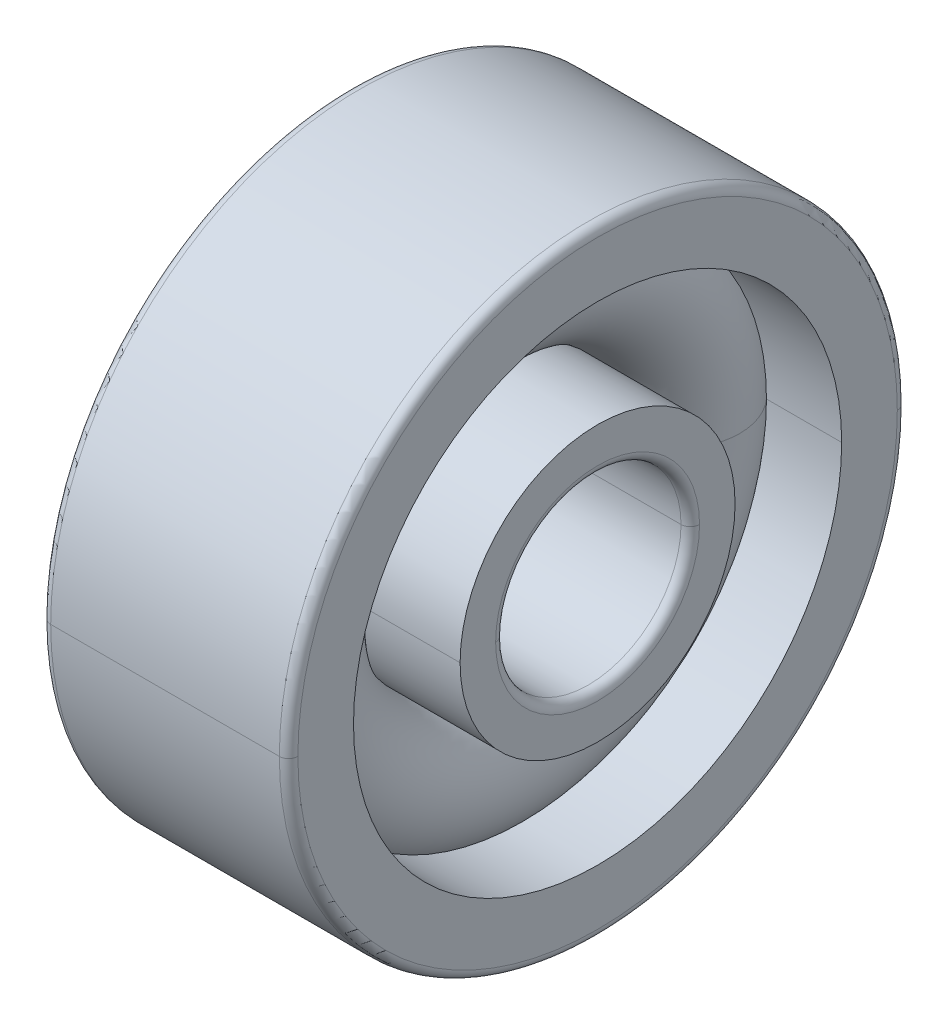
ISO-10303-21;
HEADER;
FILE_DESCRIPTION(('STEP AP214'),'2;1');
FILE_NAME('part.step','',(''),(''),'','','');
FILE_SCHEMA(('AUTOMOTIVE_DESIGN { 1 0 10303 214 1 1 1 1 }'));
ENDSEC;
DATA;
#1=APPLICATION_CONTEXT('core data for automotive mechanical design processes');
#2=APPLICATION_PROTOCOL_DEFINITION('international standard','automotive_design',2000,#1);
#3=PRODUCT_CONTEXT('',#1,'mechanical');
#4=PRODUCT('Part','Part','',(#3));
#5=PRODUCT_RELATED_PRODUCT_CATEGORY('part','',(#4));
#6=PRODUCT_DEFINITION_FORMATION('','',#4);
#7=PRODUCT_DEFINITION_CONTEXT('part definition',#1,'design');
#8=PRODUCT_DEFINITION('design','',#6,#7);
#9=PRODUCT_DEFINITION_SHAPE('','',#8);
#10=(LENGTH_UNIT() NAMED_UNIT(*) SI_UNIT(.MILLI.,.METRE.));
#11=(NAMED_UNIT(*) PLANE_ANGLE_UNIT() SI_UNIT($,.RADIAN.));
#12=(NAMED_UNIT(*) SI_UNIT($,.STERADIAN.) SOLID_ANGLE_UNIT());
#13=UNCERTAINTY_MEASURE_WITH_UNIT(LENGTH_MEASURE(1.E-05),#10,'distance_accuracy_value','');
#14=(GEOMETRIC_REPRESENTATION_CONTEXT(3) GLOBAL_UNCERTAINTY_ASSIGNED_CONTEXT((#13)) GLOBAL_UNIT_ASSIGNED_CONTEXT((#10,
#11,#12)) REPRESENTATION_CONTEXT('',''));
#15=CARTESIAN_POINT('',(0.,0.,0.));
#16=DIRECTION('',(0.,0.,1.));
#17=DIRECTION('',(1.,0.,0.));
#18=AXIS2_PLACEMENT_3D('',#15,#16,#17);
#19=CARTESIAN_POINT('',(-2.,4.275,0.));
#20=DIRECTION('',(-1.,0.,0.));
#21=DIRECTION('',(0.,0.,1.));
#22=AXIS2_PLACEMENT_3D('',#19,#20,#21);
#23=PLANE('',#22);
#24=CARTESIAN_POINT('',(-2.,0.,0.));
#25=DIRECTION('',(1.,0.,0.));
#26=DIRECTION('',(0.,0.,-1.));
#27=AXIS2_PLACEMENT_3D('',#24,#25,#26);
#28=CIRCLE('',#27,4.275);
#29=CARTESIAN_POINT('',(-2.,0.,-4.275));
#30=VERTEX_POINT('',#29);
#31=CARTESIAN_POINT('',(-2.,0.,4.275));
#32=VERTEX_POINT('',#31);
#33=EDGE_CURVE('E220',#30,#32,#28,.T.);
#34=ORIENTED_EDGE('',*,*,#33,.T.);
#35=CARTESIAN_POINT('',(-2.,0.,0.));
#36=DIRECTION('',(1.,0.,0.));
#37=DIRECTION('',(0.,0.,-1.));
#38=AXIS2_PLACEMENT_3D('',#35,#36,#37);
#39=CIRCLE('',#38,4.275);
#40=EDGE_CURVE('E250',#32,#30,#39,.T.);
#41=ORIENTED_EDGE('',*,*,#40,.T.);
#42=EDGE_LOOP('',(#34,#41));
#43=FACE_BOUND('',#42,.T.);
#44=CARTESIAN_POINT('',(-2.,0.,0.));
#45=DIRECTION('',(1.,0.,0.));
#46=DIRECTION('',(0.,0.,-1.));
#47=AXIS2_PLACEMENT_3D('',#44,#45,#46);
#48=CIRCLE('',#47,4.85);
#49=CARTESIAN_POINT('',(-2.,0.,-4.85));
#50=VERTEX_POINT('',#49);
#51=CARTESIAN_POINT('',(-2.,0.,4.85));
#52=VERTEX_POINT('',#51);
#53=EDGE_CURVE('E246',#50,#52,#48,.T.);
#54=ORIENTED_EDGE('',*,*,#53,.F.);
#55=CARTESIAN_POINT('',(-2.,0.,0.));
#56=DIRECTION('',(1.,0.,0.));
#57=DIRECTION('',(0.,0.,-1.));
#58=AXIS2_PLACEMENT_3D('',#55,#56,#57);
#59=CIRCLE('',#58,4.85);
#60=EDGE_CURVE('E19',#52,#50,#59,.T.);
#61=ORIENTED_EDGE('',*,*,#60,.F.);
#62=EDGE_LOOP('',(#54,#61));
#63=FACE_BOUND('',#62,.T.);
#64=ADVANCED_FACE('F16',(#43,#63),#23,.T.);
#65=CARTESIAN_POINT('',(2.,4.85,0.));
#66=DIRECTION('',(1.,0.,0.));
#67=DIRECTION('',(0.,1.,0.));
#68=AXIS2_PLACEMENT_3D('',#65,#66,#67);
#69=PLANE('',#68);
#70=CARTESIAN_POINT('',(2.,0.,0.));
#71=DIRECTION('',(1.,0.,0.));
#72=DIRECTION('',(0.,0.,-1.));
#73=AXIS2_PLACEMENT_3D('',#70,#71,#72);
#74=CIRCLE('',#73,3.95);
#75=CARTESIAN_POINT('',(2.,0.,-3.95));
#76=VERTEX_POINT('',#75);
#77=CARTESIAN_POINT('',(2.,0.,3.95));
#78=VERTEX_POINT('',#77);
#79=EDGE_CURVE('E215',#76,#78,#74,.T.);
#80=ORIENTED_EDGE('',*,*,#79,.F.);
#81=CARTESIAN_POINT('',(2.,0.,0.));
#82=DIRECTION('',(1.,0.,0.));
#83=DIRECTION('',(0.,0.,-1.));
#84=AXIS2_PLACEMENT_3D('',#81,#82,#83);
#85=CIRCLE('',#84,3.95);
#86=EDGE_CURVE('E288',#78,#76,#85,.T.);
#87=ORIENTED_EDGE('',*,*,#86,.F.);
#88=EDGE_LOOP('',(#80,#87));
#89=FACE_BOUND('',#88,.T.);
#90=CARTESIAN_POINT('',(2.,0.,0.));
#91=DIRECTION('',(1.,0.,0.));
#92=DIRECTION('',(0.,0.,-1.));
#93=AXIS2_PLACEMENT_3D('',#90,#91,#92);
#94=CIRCLE('',#93,4.85);
#95=CARTESIAN_POINT('',(2.,0.,-4.85));
#96=VERTEX_POINT('',#95);
#97=CARTESIAN_POINT('',(2.,0.,4.85));
#98=VERTEX_POINT('',#97);
#99=EDGE_CURVE('E423',#96,#98,#94,.T.);
#100=ORIENTED_EDGE('',*,*,#99,.T.);
#101=CARTESIAN_POINT('',(2.,0.,0.));
#102=DIRECTION('',(1.,0.,0.));
#103=DIRECTION('',(0.,0.,-1.));
#104=AXIS2_PLACEMENT_3D('',#101,#102,#103);
#105=CIRCLE('',#104,4.85);
#106=EDGE_CURVE('E11',#98,#96,#105,.T.);
#107=ORIENTED_EDGE('',*,*,#106,.T.);
#108=EDGE_LOOP('',(#100,#107));
#109=FACE_BOUND('',#108,.T.);
#110=ADVANCED_FACE('F439',(#89,#109),#69,.T.);
#111=CARTESIAN_POINT('',(1.85,0.,0.));
#112=DIRECTION('',(1.,0.,0.));
#113=DIRECTION('',(0.,0.,-1.));
#114=AXIS2_PLACEMENT_3D('',#111,#112,#113);
#115=TOROIDAL_SURFACE('',#114,4.85,0.149999999999999);
#116=CARTESIAN_POINT('',(1.85,0.,4.85));
#117=DIRECTION('',(0.,1.,0.));
#118=DIRECTION('',(0.,0.,1.));
#119=AXIS2_PLACEMENT_3D('',#116,#117,#118);
#120=CIRCLE('',#119,0.15);
#121=CARTESIAN_POINT('',(1.85,0.,5.));
#122=VERTEX_POINT('',#121);
#123=EDGE_CURVE('E416',#122,#98,#120,.T.);
#124=ORIENTED_EDGE('',*,*,#123,.F.);
#125=CARTESIAN_POINT('',(1.85,0.,0.));
#126=DIRECTION('',(1.,0.,0.));
#127=DIRECTION('',(0.,0.,-1.));
#128=AXIS2_PLACEMENT_3D('',#125,#126,#127);
#129=CIRCLE('',#128,5.);
#130=CARTESIAN_POINT('',(1.85,0.,-5.));
#131=VERTEX_POINT('',#130);
#132=EDGE_CURVE('E25',#122,#131,#129,.T.);
#133=ORIENTED_EDGE('',*,*,#132,.T.);
#134=CARTESIAN_POINT('',(1.85,0.,-4.85));
#135=DIRECTION('',(0.,-1.,0.));
#136=DIRECTION('',(0.,0.,-1.));
#137=AXIS2_PLACEMENT_3D('',#134,#135,#136);
#138=CIRCLE('',#137,0.15);
#139=EDGE_CURVE('E397',#131,#96,#138,.T.);
#140=ORIENTED_EDGE('',*,*,#139,.T.);
#141=ORIENTED_EDGE('',*,*,#106,.F.);
#142=EDGE_LOOP('',(#124,#133,#140,#141));
#143=FACE_BOUND('',#142,.T.);
#144=ADVANCED_FACE('F417',(#143),#115,.T.);
#145=CARTESIAN_POINT('',(-20.6375,0.,0.));
#146=DIRECTION('',(1.,0.,0.));
#147=DIRECTION('',(0.,0.,-1.));
#148=AXIS2_PLACEMENT_3D('',#145,#146,#147);
#149=CYLINDRICAL_SURFACE('',#148,5.);
#150=DIRECTION('',(1.,0.,0.));
#151=VECTOR('',#150,1.);
#152=CARTESIAN_POINT('',(-20.6375,0.,5.));
#153=LINE('',#152,#151);
#154=CARTESIAN_POINT('',(-1.85,0.,5.));
#155=VERTEX_POINT('',#154);
#156=EDGE_CURVE('E263',#155,#122,#153,.T.);
#157=ORIENTED_EDGE('',*,*,#156,.F.);
#158=CARTESIAN_POINT('',(-1.85,0.,0.));
#159=DIRECTION('',(1.,0.,0.));
#160=DIRECTION('',(0.,0.,-1.));
#161=AXIS2_PLACEMENT_3D('',#158,#159,#160);
#162=CIRCLE('',#161,5.);
#163=CARTESIAN_POINT('',(-1.85,0.,-5.));
#164=VERTEX_POINT('',#163);
#165=EDGE_CURVE('E216',#155,#164,#162,.T.);
#166=ORIENTED_EDGE('',*,*,#165,.T.);
#167=DIRECTION('',(1.,0.,0.));
#168=VECTOR('',#167,1.);
#169=CARTESIAN_POINT('',(-20.6375,0.,-5.));
#170=LINE('',#169,#168);
#171=EDGE_CURVE('E253',#164,#131,#170,.T.);
#172=ORIENTED_EDGE('',*,*,#171,.T.);
#173=ORIENTED_EDGE('',*,*,#132,.F.);
#174=EDGE_LOOP('',(#157,#166,#172,#173));
#175=FACE_BOUND('',#174,.T.);
#176=ADVANCED_FACE('F448',(#175),#149,.T.);
#177=CARTESIAN_POINT('',(-1.85,0.,0.));
#178=DIRECTION('',(1.,0.,0.));
#179=DIRECTION('',(0.,0.,-1.));
#180=AXIS2_PLACEMENT_3D('',#177,#178,#179);
#181=TOROIDAL_SURFACE('',#180,4.85,0.149999999999999);
#182=CARTESIAN_POINT('',(-1.85,0.,4.85));
#183=DIRECTION('',(0.,1.,0.));
#184=DIRECTION('',(0.,0.,1.));
#185=AXIS2_PLACEMENT_3D('',#182,#183,#184);
#186=CIRCLE('',#185,0.15);
#187=EDGE_CURVE('E239',#52,#155,#186,.T.);
#188=ORIENTED_EDGE('',*,*,#187,.F.);
#189=ORIENTED_EDGE('',*,*,#60,.T.);
#190=CARTESIAN_POINT('',(-1.85,0.,-4.85));
#191=DIRECTION('',(0.,-1.,0.));
#192=DIRECTION('',(0.,0.,-1.));
#193=AXIS2_PLACEMENT_3D('',#190,#191,#192);
#194=CIRCLE('',#193,0.15);
#195=EDGE_CURVE('E236',#50,#164,#194,.T.);
#196=ORIENTED_EDGE('',*,*,#195,.T.);
#197=ORIENTED_EDGE('',*,*,#165,.F.);
#198=EDGE_LOOP('',(#188,#189,#196,#197));
#199=FACE_BOUND('',#198,.T.);
#200=ADVANCED_FACE('F235',(#199),#181,.T.);
#201=CARTESIAN_POINT('',(-20.6375,0.,0.));
#202=DIRECTION('',(1.,0.,0.));
#203=DIRECTION('',(0.,0.,-1.));
#204=AXIS2_PLACEMENT_3D('',#201,#202,#203);
#205=CYLINDRICAL_SURFACE('',#204,4.275);
#206=DIRECTION('',(1.,0.,0.));
#207=VECTOR('',#206,1.);
#208=CARTESIAN_POINT('',(-20.6375,0.,4.275));
#209=LINE('',#208,#207);
#210=CARTESIAN_POINT('',(-0.227760839478607,0.,4.275));
#211=VERTEX_POINT('',#210);
#212=EDGE_CURVE('E267',#32,#211,#209,.T.);
#213=ORIENTED_EDGE('',*,*,#212,.F.);
#214=ORIENTED_EDGE('',*,*,#33,.F.);
#215=DIRECTION('',(1.,0.,0.));
#216=VECTOR('',#215,1.);
#217=CARTESIAN_POINT('',(-20.6375,0.,-4.275));
#218=LINE('',#217,#216);
#219=CARTESIAN_POINT('',(-0.227760839478607,0.,-4.275));
#220=VERTEX_POINT('',#219);
#221=EDGE_CURVE('E279',#30,#220,#218,.T.);
#222=ORIENTED_EDGE('',*,*,#221,.T.);
#223=CARTESIAN_POINT('',(-0.227760839478607,0.,0.));
#224=DIRECTION('',(-1.,0.,0.));
#225=DIRECTION('',(0.,0.,-1.));
#226=AXIS2_PLACEMENT_3D('',#223,#224,#225);
#227=CIRCLE('',#226,4.275);
#228=EDGE_CURVE('E293',#211,#220,#227,.T.);
#229=ORIENTED_EDGE('',*,*,#228,.F.);
#230=EDGE_LOOP('',(#213,#214,#222,#229));
#231=FACE_BOUND('',#230,.T.);
#232=ADVANCED_FACE('F382',(#231),#205,.F.);
#233=CARTESIAN_POINT('',(-20.6375,0.,0.));
#234=DIRECTION('',(1.,0.,0.));
#235=DIRECTION('',(0.,0.,-1.));
#236=AXIS2_PLACEMENT_3D('',#233,#234,#235);
#237=CYLINDRICAL_SURFACE('',#236,3.95);
#238=DIRECTION('',(1.,0.,0.));
#239=VECTOR('',#238,1.);
#240=CARTESIAN_POINT('',(-20.6375,0.,3.95));
#241=LINE('',#240,#239);
#242=CARTESIAN_POINT('',(0.782623792124926,0.,3.95));
#243=VERTEX_POINT('',#242);
#244=EDGE_CURVE('E284',#243,#78,#241,.T.);
#245=ORIENTED_EDGE('',*,*,#244,.F.);
#246=CARTESIAN_POINT('',(0.782623792124926,0.,0.));
#247=DIRECTION('',(1.,0.,0.));
#248=DIRECTION('',(0.,0.,1.));
#249=AXIS2_PLACEMENT_3D('',#246,#247,#248);
#250=CIRCLE('',#249,3.95);
#251=CARTESIAN_POINT('',(0.782623792124926,0.,-3.95));
#252=VERTEX_POINT('',#251);
#253=EDGE_CURVE('E179',#252,#243,#250,.T.);
#254=ORIENTED_EDGE('',*,*,#253,.F.);
#255=DIRECTION('',(1.,0.,0.));
#256=VECTOR('',#255,1.);
#257=CARTESIAN_POINT('',(-20.6375,0.,-3.95));
#258=LINE('',#257,#256);
#259=EDGE_CURVE('E289',#252,#76,#258,.T.);
#260=ORIENTED_EDGE('',*,*,#259,.T.);
#261=ORIENTED_EDGE('',*,*,#79,.T.);
#262=EDGE_LOOP('',(#245,#254,#260,#261));
#263=FACE_BOUND('',#262,.T.);
#264=ADVANCED_FACE('F457',(#263),#237,.F.);
#265=CARTESIAN_POINT('',(0.,0.,0.));
#266=DIRECTION('',(-1.,0.,0.));
#267=DIRECTION('',(0.,0.,1.));
#268=AXIS2_PLACEMENT_3D('',#265,#266,#267);
#269=TOROIDAL_SURFACE('',#268,3.25,1.05);
#270=CARTESIAN_POINT('',(0.,0.,-3.25));
#271=DIRECTION('',(0.,1.,0.));
#272=DIRECTION('',(0.,0.,1.));
#273=AXIS2_PLACEMENT_3D('',#270,#271,#272);
#274=CIRCLE('',#273,1.05);
#275=CARTESIAN_POINT('',(-0.782623792124927,0.,-2.55));
#276=VERTEX_POINT('',#275);
#277=EDGE_CURVE('E297',#220,#276,#274,.T.);
#278=ORIENTED_EDGE('',*,*,#277,.F.);
#279=CARTESIAN_POINT('',(-0.227760839478607,0.,0.));
#280=DIRECTION('',(-1.,0.,0.));
#281=DIRECTION('',(0.,0.,-1.));
#282=AXIS2_PLACEMENT_3D('',#279,#280,#281);
#283=CIRCLE('',#282,4.275);
#284=EDGE_CURVE('E270',#220,#211,#283,.T.);
#285=ORIENTED_EDGE('',*,*,#284,.T.);
#286=CARTESIAN_POINT('',(0.,0.,3.25));
#287=DIRECTION('',(0.,-1.,0.));
#288=DIRECTION('',(0.,0.,-1.));
#289=AXIS2_PLACEMENT_3D('',#286,#287,#288);
#290=CIRCLE('',#289,1.05);
#291=CARTESIAN_POINT('',(-0.782623792124927,0.,2.55));
#292=VERTEX_POINT('',#291);
#293=EDGE_CURVE('E305',#211,#292,#290,.T.);
#294=ORIENTED_EDGE('',*,*,#293,.T.);
#295=CARTESIAN_POINT('',(-0.782623792124927,0.,0.));
#296=DIRECTION('',(1.,0.,0.));
#297=DIRECTION('',(0.,0.,-1.));
#298=AXIS2_PLACEMENT_3D('',#295,#296,#297);
#299=CIRCLE('',#298,2.55);
#300=EDGE_CURVE('E212',#292,#276,#299,.T.);
#301=ORIENTED_EDGE('',*,*,#300,.T.);
#302=EDGE_LOOP('',(#278,#285,#294,#301));
#303=FACE_BOUND('',#302,.T.);
#304=ADVANCED_FACE('F375',(#303),#269,.T.);
#305=CARTESIAN_POINT('',(-2.,2.55,0.));
#306=DIRECTION('',(-1.,0.,0.));
#307=DIRECTION('',(0.,0.,1.));
#308=AXIS2_PLACEMENT_3D('',#305,#306,#307);
#309=PLANE('',#308);
#310=CARTESIAN_POINT('',(-2.,0.,0.));
#311=DIRECTION('',(1.,0.,0.));
#312=DIRECTION('',(0.,0.,-1.));
#313=AXIS2_PLACEMENT_3D('',#310,#311,#312);
#314=CIRCLE('',#313,1.65);
#315=CARTESIAN_POINT('',(-2.,0.,-1.65));
#316=VERTEX_POINT('',#315);
#317=CARTESIAN_POINT('',(-2.,0.,1.65));
#318=VERTEX_POINT('',#317);
#319=EDGE_CURVE('E325',#316,#318,#314,.T.);
#320=ORIENTED_EDGE('',*,*,#319,.T.);
#321=CARTESIAN_POINT('',(-2.,0.,0.));
#322=DIRECTION('',(1.,0.,0.));
#323=DIRECTION('',(0.,0.,-1.));
#324=AXIS2_PLACEMENT_3D('',#321,#322,#323);
#325=CIRCLE('',#324,1.65);
#326=EDGE_CURVE('E211',#318,#316,#325,.T.);
#327=ORIENTED_EDGE('',*,*,#326,.T.);
#328=EDGE_LOOP('',(#320,#327));
#329=FACE_BOUND('',#328,.T.);
#330=CARTESIAN_POINT('',(-2.,0.,0.));
#331=DIRECTION('',(1.,0.,0.));
#332=DIRECTION('',(0.,0.,-1.));
#333=AXIS2_PLACEMENT_3D('',#330,#331,#332);
#334=CIRCLE('',#333,2.55);
#335=CARTESIAN_POINT('',(-2.,0.,-2.55));
#336=VERTEX_POINT('',#335);
#337=CARTESIAN_POINT('',(-2.,0.,2.55));
#338=VERTEX_POINT('',#337);
#339=EDGE_CURVE('E329',#336,#338,#334,.T.);
#340=ORIENTED_EDGE('',*,*,#339,.F.);
#341=CARTESIAN_POINT('',(-2.,0.,0.));
#342=DIRECTION('',(1.,0.,0.));
#343=DIRECTION('',(0.,0.,-1.));
#344=AXIS2_PLACEMENT_3D('',#341,#342,#343);
#345=CIRCLE('',#344,2.55);
#346=EDGE_CURVE('E274',#338,#336,#345,.T.);
#347=ORIENTED_EDGE('',*,*,#346,.F.);
#348=EDGE_LOOP('',(#340,#347));
#349=FACE_BOUND('',#348,.T.);
#350=ADVANCED_FACE('F461',(#329,#349),#309,.T.);
#351=CARTESIAN_POINT('',(-1.85,0.,0.));
#352=DIRECTION('',(1.,0.,0.));
#353=DIRECTION('',(0.,0.,-1.));
#354=AXIS2_PLACEMENT_3D('',#351,#352,#353);
#355=TOROIDAL_SURFACE('',#354,1.65,0.15);
#356=CARTESIAN_POINT('',(-1.85,0.,1.65));
#357=DIRECTION('',(0.,1.,0.));
#358=DIRECTION('',(0.,0.,1.));
#359=AXIS2_PLACEMENT_3D('',#356,#357,#358);
#360=CIRCLE('',#359,0.15);
#361=CARTESIAN_POINT('',(-1.85,0.,1.5));
#362=VERTEX_POINT('',#361);
#363=EDGE_CURVE('E319',#362,#318,#360,.T.);
#364=ORIENTED_EDGE('',*,*,#363,.F.);
#365=CARTESIAN_POINT('',(-1.85,0.,0.));
#366=DIRECTION('',(1.,0.,0.));
#367=DIRECTION('',(0.,0.,-1.));
#368=AXIS2_PLACEMENT_3D('',#365,#366,#367);
#369=CIRCLE('',#368,1.5);
#370=CARTESIAN_POINT('',(-1.85,0.,-1.5));
#371=VERTEX_POINT('',#370);
#372=EDGE_CURVE('E338',#362,#371,#369,.T.);
#373=ORIENTED_EDGE('',*,*,#372,.T.);
#374=CARTESIAN_POINT('',(-1.85,0.,-1.65));
#375=DIRECTION('',(0.,-1.,0.));
#376=DIRECTION('',(0.,0.,-1.));
#377=AXIS2_PLACEMENT_3D('',#374,#375,#376);
#378=CIRCLE('',#377,0.15);
#379=EDGE_CURVE('E334',#371,#316,#378,.T.);
#380=ORIENTED_EDGE('',*,*,#379,.T.);
#381=ORIENTED_EDGE('',*,*,#326,.F.);
#382=EDGE_LOOP('',(#364,#373,#380,#381));
#383=FACE_BOUND('',#382,.T.);
#384=ADVANCED_FACE('F464',(#383),#355,.T.);
#385=CARTESIAN_POINT('',(-20.6375,0.,0.));
#386=DIRECTION('',(1.,0.,0.));
#387=DIRECTION('',(0.,0.,-1.));
#388=AXIS2_PLACEMENT_3D('',#385,#386,#387);
#389=CYLINDRICAL_SURFACE('',#388,1.5);
#390=DIRECTION('',(1.,0.,0.));
#391=VECTOR('',#390,1.);
#392=CARTESIAN_POINT('',(-20.6375,0.,1.5));
#393=LINE('',#392,#391);
#394=CARTESIAN_POINT('',(1.85,0.,1.5));
#395=VERTEX_POINT('',#394);
#396=EDGE_CURVE('E311',#362,#395,#393,.T.);
#397=ORIENTED_EDGE('',*,*,#396,.F.);
#398=CARTESIAN_POINT('',(-1.85,0.,0.));
#399=DIRECTION('',(1.,0.,0.));
#400=DIRECTION('',(0.,0.,-1.));
#401=AXIS2_PLACEMENT_3D('',#398,#399,#400);
#402=CIRCLE('',#401,1.5);
#403=EDGE_CURVE('E315',#371,#362,#402,.T.);
#404=ORIENTED_EDGE('',*,*,#403,.F.);
#405=DIRECTION('',(1.,0.,0.));
#406=VECTOR('',#405,1.);
#407=CARTESIAN_POINT('',(-20.6375,0.,-1.5));
#408=LINE('',#407,#406);
#409=CARTESIAN_POINT('',(1.85,0.,-1.5));
#410=VERTEX_POINT('',#409);
#411=EDGE_CURVE('E310',#371,#410,#408,.T.);
#412=ORIENTED_EDGE('',*,*,#411,.T.);
#413=CARTESIAN_POINT('',(1.85,0.,0.));
#414=DIRECTION('',(1.,0.,0.));
#415=DIRECTION('',(0.,0.,-1.));
#416=AXIS2_PLACEMENT_3D('',#413,#414,#415);
#417=CIRCLE('',#416,1.5);
#418=EDGE_CURVE('E330',#410,#395,#417,.T.);
#419=ORIENTED_EDGE('',*,*,#418,.T.);
#420=EDGE_LOOP('',(#397,#404,#412,#419));
#421=FACE_BOUND('',#420,.T.);
#422=ADVANCED_FACE('F468',(#421),#389,.F.);
#423=CARTESIAN_POINT('',(1.85,0.,0.));
#424=DIRECTION('',(1.,0.,0.));
#425=DIRECTION('',(0.,0.,-1.));
#426=AXIS2_PLACEMENT_3D('',#423,#424,#425);
#427=TOROIDAL_SURFACE('',#426,1.65,0.15);
#428=CARTESIAN_POINT('',(1.85,0.,1.65));
#429=DIRECTION('',(0.,1.,0.));
#430=DIRECTION('',(0.,0.,1.));
#431=AXIS2_PLACEMENT_3D('',#428,#429,#430);
#432=CIRCLE('',#431,0.15);
#433=CARTESIAN_POINT('',(2.,0.,1.65));
#434=VERTEX_POINT('',#433);
#435=EDGE_CURVE('E352',#434,#395,#432,.T.);
#436=ORIENTED_EDGE('',*,*,#435,.F.);
#437=CARTESIAN_POINT('',(2.,0.,0.));
#438=DIRECTION('',(1.,0.,0.));
#439=DIRECTION('',(0.,0.,-1.));
#440=AXIS2_PLACEMENT_3D('',#437,#438,#439);
#441=CIRCLE('',#440,1.65);
#442=CARTESIAN_POINT('',(2.,0.,-1.65));
#443=VERTEX_POINT('',#442);
#444=EDGE_CURVE('E208',#434,#443,#441,.T.);
#445=ORIENTED_EDGE('',*,*,#444,.T.);
#446=CARTESIAN_POINT('',(1.85,0.,-1.65));
#447=DIRECTION('',(0.,-1.,0.));
#448=DIRECTION('',(0.,0.,-1.));
#449=AXIS2_PLACEMENT_3D('',#446,#447,#448);
#450=CIRCLE('',#449,0.15);
#451=EDGE_CURVE('E326',#443,#410,#450,.T.);
#452=ORIENTED_EDGE('',*,*,#451,.T.);
#453=CARTESIAN_POINT('',(1.85,0.,0.));
#454=DIRECTION('',(1.,0.,0.));
#455=DIRECTION('',(0.,0.,-1.));
#456=AXIS2_PLACEMENT_3D('',#453,#454,#455);
#457=CIRCLE('',#456,1.5);
#458=EDGE_CURVE('E306',#395,#410,#457,.T.);
#459=ORIENTED_EDGE('',*,*,#458,.F.);
#460=EDGE_LOOP('',(#436,#445,#452,#459));
#461=FACE_BOUND('',#460,.T.);
#462=ADVANCED_FACE('F472',(#461),#427,.T.);
#463=CARTESIAN_POINT('',(2.,1.65,0.));
#464=DIRECTION('',(1.,0.,0.));
#465=DIRECTION('',(0.,1.,0.));
#466=AXIS2_PLACEMENT_3D('',#463,#464,#465);
#467=PLANE('',#466);
#468=CARTESIAN_POINT('',(2.,0.,0.));
#469=DIRECTION('',(1.,0.,0.));
#470=DIRECTION('',(0.,0.,-1.));
#471=AXIS2_PLACEMENT_3D('',#468,#469,#470);
#472=CIRCLE('',#471,1.65);
#473=EDGE_CURVE('E348',#443,#434,#472,.T.);
#474=ORIENTED_EDGE('',*,*,#473,.F.);
#475=ORIENTED_EDGE('',*,*,#444,.F.);
#476=EDGE_LOOP('',(#474,#475));
#477=FACE_BOUND('',#476,.T.);
#478=CARTESIAN_POINT('',(2.,0.,0.));
#479=DIRECTION('',(1.,0.,0.));
#480=DIRECTION('',(0.,0.,-1.));
#481=AXIS2_PLACEMENT_3D('',#478,#479,#480);
#482=CIRCLE('',#481,2.225);
#483=CARTESIAN_POINT('',(2.,0.,-2.225));
#484=VERTEX_POINT('',#483);
#485=CARTESIAN_POINT('',(2.,0.,2.225));
#486=VERTEX_POINT('',#485);
#487=EDGE_CURVE('E189',#484,#486,#482,.T.);
#488=ORIENTED_EDGE('',*,*,#487,.T.);
#489=CARTESIAN_POINT('',(2.,0.,0.));
#490=DIRECTION('',(1.,0.,0.));
#491=DIRECTION('',(0.,0.,-1.));
#492=AXIS2_PLACEMENT_3D('',#489,#490,#491);
#493=CIRCLE('',#492,2.225);
#494=EDGE_CURVE('E38',#486,#484,#493,.T.);
#495=ORIENTED_EDGE('',*,*,#494,.T.);
#496=EDGE_LOOP('',(#488,#495));
#497=FACE_BOUND('',#496,.T.);
#498=ADVANCED_FACE('F476',(#477,#497),#467,.T.);
#499=CARTESIAN_POINT('',(-20.6375,0.,0.));
#500=DIRECTION('',(1.,0.,0.));
#501=DIRECTION('',(0.,0.,-1.));
#502=AXIS2_PLACEMENT_3D('',#499,#500,#501);
#503=CYLINDRICAL_SURFACE('',#502,2.55);
#504=DIRECTION('',(1.,0.,0.));
#505=VECTOR('',#504,1.);
#506=CARTESIAN_POINT('',(-20.6375,0.,2.55));
#507=LINE('',#506,#505);
#508=EDGE_CURVE('E200',#338,#292,#507,.T.);
#509=ORIENTED_EDGE('',*,*,#508,.F.);
#510=ORIENTED_EDGE('',*,*,#346,.T.);
#511=DIRECTION('',(1.,0.,0.));
#512=VECTOR('',#511,1.);
#513=CARTESIAN_POINT('',(-20.6375,0.,-2.55));
#514=LINE('',#513,#512);
#515=EDGE_CURVE('E194',#336,#276,#514,.T.);
#516=ORIENTED_EDGE('',*,*,#515,.T.);
#517=ORIENTED_EDGE('',*,*,#300,.F.);
#518=EDGE_LOOP('',(#509,#510,#516,#517));
#519=FACE_BOUND('',#518,.T.);
#520=ADVANCED_FACE('F480',(#519),#503,.T.);
#521=CARTESIAN_POINT('',(-20.6375,0.,0.));
#522=DIRECTION('',(1.,0.,0.));
#523=DIRECTION('',(0.,0.,-1.));
#524=AXIS2_PLACEMENT_3D('',#521,#522,#523);
#525=CYLINDRICAL_SURFACE('',#524,2.225);
#526=DIRECTION('',(1.,0.,0.));
#527=VECTOR('',#526,1.);
#528=CARTESIAN_POINT('',(-20.6375,0.,2.225));
#529=LINE('',#528,#527);
#530=CARTESIAN_POINT('',(0.227760839478607,0.,2.225));
#531=VERTEX_POINT('',#530);
#532=EDGE_CURVE('E184',#531,#486,#529,.T.);
#533=ORIENTED_EDGE('',*,*,#532,.F.);
#534=CARTESIAN_POINT('',(0.227760839478607,0.,0.));
#535=DIRECTION('',(-1.,0.,0.));
#536=DIRECTION('',(0.,0.,1.));
#537=AXIS2_PLACEMENT_3D('',#534,#535,#536);
#538=CIRCLE('',#537,2.225);
#539=CARTESIAN_POINT('',(0.227760839478607,0.,-2.225));
#540=VERTEX_POINT('',#539);
#541=EDGE_CURVE('E163',#540,#531,#538,.T.);
#542=ORIENTED_EDGE('',*,*,#541,.F.);
#543=DIRECTION('',(1.,0.,0.));
#544=VECTOR('',#543,1.);
#545=CARTESIAN_POINT('',(-20.6375,0.,-2.225));
#546=LINE('',#545,#544);
#547=EDGE_CURVE('E192',#540,#484,#546,.T.);
#548=ORIENTED_EDGE('',*,*,#547,.T.);
#549=ORIENTED_EDGE('',*,*,#494,.F.);
#550=EDGE_LOOP('',(#533,#542,#548,#549));
#551=FACE_BOUND('',#550,.T.);
#552=ADVANCED_FACE('F185',(#551),#525,.T.);
#553=CARTESIAN_POINT('',(0.,0.,0.));
#554=DIRECTION('',(-1.,0.,0.));
#555=DIRECTION('',(0.,0.,1.));
#556=AXIS2_PLACEMENT_3D('',#553,#554,#555);
#557=TOROIDAL_SURFACE('',#556,3.25,1.05);
#558=CARTESIAN_POINT('',(0.,0.,-3.25));
#559=DIRECTION('',(0.,1.,0.));
#560=DIRECTION('',(0.,0.,1.));
#561=AXIS2_PLACEMENT_3D('',#558,#559,#560);
#562=CIRCLE('',#561,1.05);
#563=EDGE_CURVE('E170',#540,#252,#562,.T.);
#564=ORIENTED_EDGE('',*,*,#563,.F.);
#565=ORIENTED_EDGE('',*,*,#541,.T.);
#566=CARTESIAN_POINT('',(0.,0.,3.25));
#567=DIRECTION('',(0.,-1.,0.));
#568=DIRECTION('',(0.,0.,-1.));
#569=AXIS2_PLACEMENT_3D('',#566,#567,#568);
#570=CIRCLE('',#569,1.05);
#571=EDGE_CURVE('E167',#531,#243,#570,.T.);
#572=ORIENTED_EDGE('',*,*,#571,.T.);
#573=CARTESIAN_POINT('',(0.782623792124926,0.,0.));
#574=DIRECTION('',(1.,0.,0.));
#575=DIRECTION('',(0.,0.,1.));
#576=AXIS2_PLACEMENT_3D('',#573,#574,#575);
#577=CIRCLE('',#576,3.95);
#578=EDGE_CURVE('E283',#243,#252,#577,.T.);
#579=ORIENTED_EDGE('',*,*,#578,.T.);
#580=EDGE_LOOP('',(#564,#565,#572,#579));
#581=FACE_BOUND('',#580,.T.);
#582=ADVANCED_FACE('F165',(#581),#557,.T.);
#583=CARTESIAN_POINT('',(0.,0.,0.));
#584=DIRECTION('',(-1.,0.,0.));
#585=DIRECTION('',(0.,0.,1.));
#586=AXIS2_PLACEMENT_3D('',#583,#584,#585);
#587=TOROIDAL_SURFACE('',#586,3.25,1.05);
#588=CARTESIAN_POINT('',(0.227760839478607,0.,0.));
#589=DIRECTION('',(-1.,0.,0.));
#590=DIRECTION('',(0.,0.,1.));
#591=AXIS2_PLACEMENT_3D('',#588,#589,#590);
#592=CIRCLE('',#591,2.225);
#593=EDGE_CURVE('E178',#531,#540,#592,.T.);
#594=ORIENTED_EDGE('',*,*,#593,.T.);
#595=ORIENTED_EDGE('',*,*,#563,.T.);
#596=ORIENTED_EDGE('',*,*,#253,.T.);
#597=ORIENTED_EDGE('',*,*,#571,.F.);
#598=EDGE_LOOP('',(#594,#595,#596,#597));
#599=FACE_BOUND('',#598,.T.);
#600=ADVANCED_FACE('F176',(#599),#587,.T.);
#601=CARTESIAN_POINT('',(-20.6375,0.,0.));
#602=DIRECTION('',(1.,0.,0.));
#603=DIRECTION('',(0.,0.,-1.));
#604=AXIS2_PLACEMENT_3D('',#601,#602,#603);
#605=CYLINDRICAL_SURFACE('',#604,2.225);
#606=ORIENTED_EDGE('',*,*,#593,.F.);
#607=ORIENTED_EDGE('',*,*,#532,.T.);
#608=ORIENTED_EDGE('',*,*,#487,.F.);
#609=ORIENTED_EDGE('',*,*,#547,.F.);
#610=EDGE_LOOP('',(#606,#607,#608,#609));
#611=FACE_BOUND('',#610,.T.);
#612=ADVANCED_FACE('F191',(#611),#605,.T.);
#613=CARTESIAN_POINT('',(-20.6375,0.,0.));
#614=DIRECTION('',(1.,0.,0.));
#615=DIRECTION('',(0.,0.,-1.));
#616=AXIS2_PLACEMENT_3D('',#613,#614,#615);
#617=CYLINDRICAL_SURFACE('',#616,2.55);
#618=ORIENTED_EDGE('',*,*,#339,.T.);
#619=ORIENTED_EDGE('',*,*,#508,.T.);
#620=CARTESIAN_POINT('',(-0.782623792124927,0.,0.));
#621=DIRECTION('',(1.,0.,0.));
#622=DIRECTION('',(0.,0.,-1.));
#623=AXIS2_PLACEMENT_3D('',#620,#621,#622);
#624=CIRCLE('',#623,2.55);
#625=EDGE_CURVE('E301',#276,#292,#624,.T.);
#626=ORIENTED_EDGE('',*,*,#625,.F.);
#627=ORIENTED_EDGE('',*,*,#515,.F.);
#628=EDGE_LOOP('',(#618,#619,#626,#627));
#629=FACE_BOUND('',#628,.T.);
#630=ADVANCED_FACE('F369',(#629),#617,.T.);
#631=CARTESIAN_POINT('',(1.85,0.,0.));
#632=DIRECTION('',(1.,0.,0.));
#633=DIRECTION('',(0.,0.,-1.));
#634=AXIS2_PLACEMENT_3D('',#631,#632,#633);
#635=TOROIDAL_SURFACE('',#634,1.65,0.15);
#636=ORIENTED_EDGE('',*,*,#473,.T.);
#637=ORIENTED_EDGE('',*,*,#435,.T.);
#638=ORIENTED_EDGE('',*,*,#418,.F.);
#639=ORIENTED_EDGE('',*,*,#451,.F.);
#640=EDGE_LOOP('',(#636,#637,#638,#639));
#641=FACE_BOUND('',#640,.T.);
#642=ADVANCED_FACE('F490',(#641),#635,.T.);
#643=CARTESIAN_POINT('',(-20.6375,0.,0.));
#644=DIRECTION('',(1.,0.,0.));
#645=DIRECTION('',(0.,0.,-1.));
#646=AXIS2_PLACEMENT_3D('',#643,#644,#645);
#647=CYLINDRICAL_SURFACE('',#646,1.5);
#648=ORIENTED_EDGE('',*,*,#372,.F.);
#649=ORIENTED_EDGE('',*,*,#396,.T.);
#650=ORIENTED_EDGE('',*,*,#458,.T.);
#651=ORIENTED_EDGE('',*,*,#411,.F.);
#652=EDGE_LOOP('',(#648,#649,#650,#651));
#653=FACE_BOUND('',#652,.T.);
#654=ADVANCED_FACE('F491',(#653),#647,.F.);
#655=CARTESIAN_POINT('',(-1.85,0.,0.));
#656=DIRECTION('',(1.,0.,0.));
#657=DIRECTION('',(0.,0.,-1.));
#658=AXIS2_PLACEMENT_3D('',#655,#656,#657);
#659=TOROIDAL_SURFACE('',#658,1.65,0.15);
#660=ORIENTED_EDGE('',*,*,#403,.T.);
#661=ORIENTED_EDGE('',*,*,#363,.T.);
#662=ORIENTED_EDGE('',*,*,#319,.F.);
#663=ORIENTED_EDGE('',*,*,#379,.F.);
#664=EDGE_LOOP('',(#660,#661,#662,#663));
#665=FACE_BOUND('',#664,.T.);
#666=ADVANCED_FACE('F494',(#665),#659,.T.);
#667=CARTESIAN_POINT('',(0.,0.,0.));
#668=DIRECTION('',(-1.,0.,0.));
#669=DIRECTION('',(0.,0.,1.));
#670=AXIS2_PLACEMENT_3D('',#667,#668,#669);
#671=TOROIDAL_SURFACE('',#670,3.25,1.05);
#672=ORIENTED_EDGE('',*,*,#228,.T.);
#673=ORIENTED_EDGE('',*,*,#277,.T.);
#674=ORIENTED_EDGE('',*,*,#625,.T.);
#675=ORIENTED_EDGE('',*,*,#293,.F.);
#676=EDGE_LOOP('',(#672,#673,#674,#675));
#677=FACE_BOUND('',#676,.T.);
#678=ADVANCED_FACE('F379',(#677),#671,.T.);
#679=CARTESIAN_POINT('',(-20.6375,0.,0.));
#680=DIRECTION('',(1.,0.,0.));
#681=DIRECTION('',(0.,0.,-1.));
#682=AXIS2_PLACEMENT_3D('',#679,#680,#681);
#683=CYLINDRICAL_SURFACE('',#682,3.95);
#684=ORIENTED_EDGE('',*,*,#578,.F.);
#685=ORIENTED_EDGE('',*,*,#244,.T.);
#686=ORIENTED_EDGE('',*,*,#86,.T.);
#687=ORIENTED_EDGE('',*,*,#259,.F.);
#688=EDGE_LOOP('',(#684,#685,#686,#687));
#689=FACE_BOUND('',#688,.T.);
#690=ADVANCED_FACE('F503',(#689),#683,.F.);
#691=CARTESIAN_POINT('',(-20.6375,0.,0.));
#692=DIRECTION('',(1.,0.,0.));
#693=DIRECTION('',(0.,0.,-1.));
#694=AXIS2_PLACEMENT_3D('',#691,#692,#693);
#695=CYLINDRICAL_SURFACE('',#694,4.275);
#696=ORIENTED_EDGE('',*,*,#40,.F.);
#697=ORIENTED_EDGE('',*,*,#212,.T.);
#698=ORIENTED_EDGE('',*,*,#284,.F.);
#699=ORIENTED_EDGE('',*,*,#221,.F.);
#700=EDGE_LOOP('',(#696,#697,#698,#699));
#701=FACE_BOUND('',#700,.T.);
#702=ADVANCED_FACE('F385',(#701),#695,.F.);
#703=CARTESIAN_POINT('',(-1.85,0.,0.));
#704=DIRECTION('',(1.,0.,0.));
#705=DIRECTION('',(0.,0.,-1.));
#706=AXIS2_PLACEMENT_3D('',#703,#704,#705);
#707=TOROIDAL_SURFACE('',#706,4.85,0.149999999999999);
#708=ORIENTED_EDGE('',*,*,#53,.T.);
#709=ORIENTED_EDGE('',*,*,#187,.T.);
#710=CARTESIAN_POINT('',(-1.85,0.,0.));
#711=DIRECTION('',(1.,0.,0.));
#712=DIRECTION('',(0.,0.,-1.));
#713=AXIS2_PLACEMENT_3D('',#710,#711,#712);
#714=CIRCLE('',#713,5.);
#715=EDGE_CURVE('E248',#164,#155,#714,.T.);
#716=ORIENTED_EDGE('',*,*,#715,.F.);
#717=ORIENTED_EDGE('',*,*,#195,.F.);
#718=EDGE_LOOP('',(#708,#709,#716,#717));
#719=FACE_BOUND('',#718,.T.);
#720=ADVANCED_FACE('F245',(#719),#707,.T.);
#721=CARTESIAN_POINT('',(-20.6375,0.,0.));
#722=DIRECTION('',(1.,0.,0.));
#723=DIRECTION('',(0.,0.,-1.));
#724=AXIS2_PLACEMENT_3D('',#721,#722,#723);
#725=CYLINDRICAL_SURFACE('',#724,5.);
#726=ORIENTED_EDGE('',*,*,#715,.T.);
#727=ORIENTED_EDGE('',*,*,#156,.T.);
#728=CARTESIAN_POINT('',(1.85,0.,0.));
#729=DIRECTION('',(1.,0.,0.));
#730=DIRECTION('',(0.,0.,-1.));
#731=AXIS2_PLACEMENT_3D('',#728,#729,#730);
#732=CIRCLE('',#731,5.);
#733=EDGE_CURVE('E411',#131,#122,#732,.T.);
#734=ORIENTED_EDGE('',*,*,#733,.F.);
#735=ORIENTED_EDGE('',*,*,#171,.F.);
#736=EDGE_LOOP('',(#726,#727,#734,#735));
#737=FACE_BOUND('',#736,.T.);
#738=ADVANCED_FACE('F408',(#737),#725,.T.);
#739=CARTESIAN_POINT('',(1.85,0.,0.));
#740=DIRECTION('',(1.,0.,0.));
#741=DIRECTION('',(0.,0.,-1.));
#742=AXIS2_PLACEMENT_3D('',#739,#740,#741);
#743=TOROIDAL_SURFACE('',#742,4.85,0.149999999999999);
#744=ORIENTED_EDGE('',*,*,#733,.T.);
#745=ORIENTED_EDGE('',*,*,#123,.T.);
#746=ORIENTED_EDGE('',*,*,#99,.F.);
#747=ORIENTED_EDGE('',*,*,#139,.F.);
#748=EDGE_LOOP('',(#744,#745,#746,#747));
#749=FACE_BOUND('',#748,.T.);
#750=ADVANCED_FACE('F426',(#749),#743,.T.);
#751=CLOSED_SHELL('',(#64,#110,#144,#176,#200,#232,#264,#304,#350,#384,#422,#462,#498,#520,#552,
#582,#600,#612,#630,#642,#654,#666,#678,#690,#702,#720,#738,#750));
#752=MANIFOLD_SOLID_BREP('B1',#751);
#753=ADVANCED_BREP_SHAPE_REPRESENTATION('',(#18,#752),#14);
#754=SHAPE_DEFINITION_REPRESENTATION(#9,#753);
ENDSEC;
END-ISO-10303-21;
